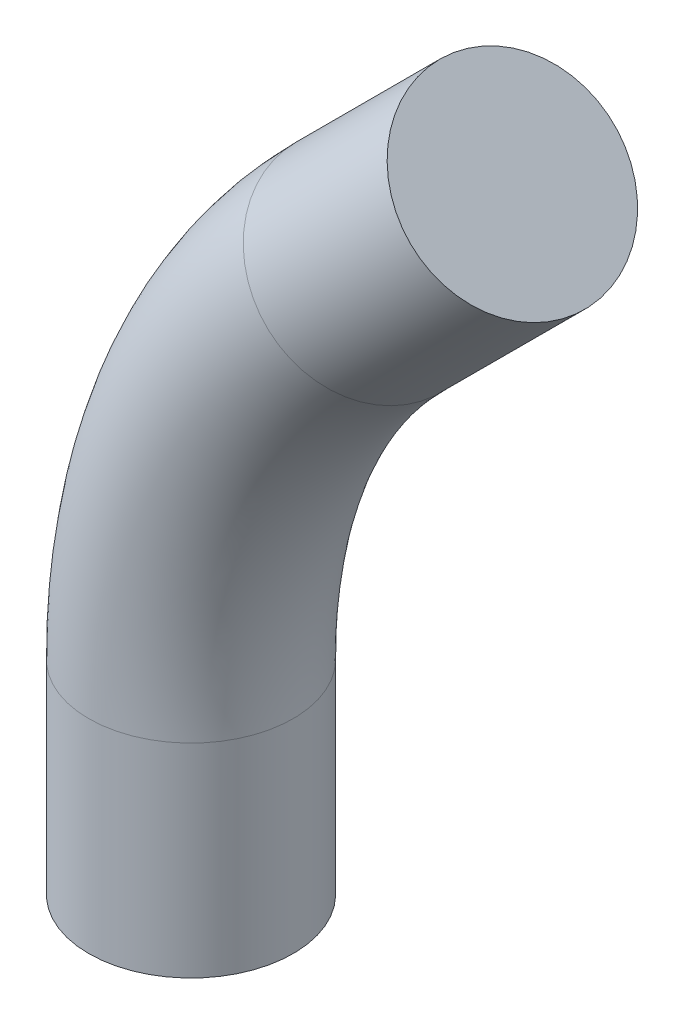
ISO-10303-21;
HEADER;
FILE_DESCRIPTION(('STEP AP214'),'2;1');
FILE_NAME('part.step','',(''),(''),'','','');
FILE_SCHEMA(('AUTOMOTIVE_DESIGN { 1 0 10303 214 1 1 1 1 }'));
ENDSEC;
DATA;
#1=APPLICATION_CONTEXT('core data for automotive mechanical design processes');
#2=APPLICATION_PROTOCOL_DEFINITION('international standard','automotive_design',2000,#1);
#3=PRODUCT_CONTEXT('',#1,'mechanical');
#4=PRODUCT('Part','Part','',(#3));
#5=PRODUCT_RELATED_PRODUCT_CATEGORY('part','',(#4));
#6=PRODUCT_DEFINITION_FORMATION('','',#4);
#7=PRODUCT_DEFINITION_CONTEXT('part definition',#1,'design');
#8=PRODUCT_DEFINITION('design','',#6,#7);
#9=PRODUCT_DEFINITION_SHAPE('','',#8);
#10=(LENGTH_UNIT() NAMED_UNIT(*) SI_UNIT(.MILLI.,.METRE.));
#11=(NAMED_UNIT(*) PLANE_ANGLE_UNIT() SI_UNIT($,.RADIAN.));
#12=(NAMED_UNIT(*) SI_UNIT($,.STERADIAN.) SOLID_ANGLE_UNIT());
#13=UNCERTAINTY_MEASURE_WITH_UNIT(LENGTH_MEASURE(1.E-05),#10,'distance_accuracy_value','');
#14=(GEOMETRIC_REPRESENTATION_CONTEXT(3) GLOBAL_UNCERTAINTY_ASSIGNED_CONTEXT((#13)) GLOBAL_UNIT_ASSIGNED_CONTEXT((#10,
#11,#12)) REPRESENTATION_CONTEXT('',''));
#15=CARTESIAN_POINT('',(0.,0.,0.));
#16=DIRECTION('',(0.,0.,1.));
#17=DIRECTION('',(1.,0.,0.));
#18=AXIS2_PLACEMENT_3D('',#15,#16,#17);
#19=CARTESIAN_POINT('',(0.,0.,0.));
#20=DIRECTION('',(0.,1.,0.));
#21=DIRECTION('',(0.,0.,1.));
#22=AXIS2_PLACEMENT_3D('',#19,#20,#21);
#23=PLANE('',#22);
#24=CARTESIAN_POINT('',(0.,0.,0.));
#25=DIRECTION('',(0.,1.,0.));
#26=DIRECTION('',(0.,0.,1.));
#27=AXIS2_PLACEMENT_3D('',#24,#25,#26);
#28=CIRCLE('',#27,6.75);
#29=CARTESIAN_POINT('',(0.,0.,6.75));
#30=VERTEX_POINT('',#29);
#31=EDGE_CURVE('E44',#30,#30,#28,.T.);
#32=ORIENTED_EDGE('',*,*,#31,.F.);
#33=EDGE_LOOP('',(#32));
#34=FACE_BOUND('',#33,.T.);
#35=ADVANCED_FACE('F32',(#34),#23,.F.);
#36=CARTESIAN_POINT('',(21.2132034355965,51.2132034355964,0.));
#37=DIRECTION('',(0.707106781186548,0.707106781186547,0.));
#38=DIRECTION('',(0.,0.,1.));
#39=AXIS2_PLACEMENT_3D('',#36,#37,#38);
#40=PLANE('',#39);
#41=CARTESIAN_POINT('',(21.2132034355965,51.2132034355964,0.));
#42=DIRECTION('',(0.707106781186548,0.707106781186547,0.));
#43=DIRECTION('',(0.,0.,1.));
#44=AXIS2_PLACEMENT_3D('',#41,#42,#43);
#45=CIRCLE('',#44,6.75);
#46=CARTESIAN_POINT('',(21.2132034355965,51.2132034355964,6.75));
#47=VERTEX_POINT('',#46);
#48=EDGE_CURVE('E11',#47,#47,#45,.T.);
#49=ORIENTED_EDGE('',*,*,#48,.T.);
#50=EDGE_LOOP('',(#49));
#51=FACE_BOUND('',#50,.T.);
#52=ADVANCED_FACE('F47',(#51),#40,.T.);
#53=CARTESIAN_POINT('',(0.,0.,0.));
#54=DIRECTION('',(0.,1.,0.));
#55=DIRECTION('',(0.,0.,1.));
#56=AXIS2_PLACEMENT_3D('',#53,#54,#55);
#57=CYLINDRICAL_SURFACE('',#56,6.75);
#58=CARTESIAN_POINT('',(0.,13.4314575050762,0.));
#59=DIRECTION('',(0.,1.,0.));
#60=DIRECTION('',(0.,0.,1.));
#61=AXIS2_PLACEMENT_3D('',#58,#59,#60);
#62=CIRCLE('',#61,6.75);
#63=CARTESIAN_POINT('',(-6.74999999999998,13.4314575050762,0.));
#64=VERTEX_POINT('',#63);
#65=EDGE_CURVE('E57',#64,#64,#62,.T.);
#66=ORIENTED_EDGE('',*,*,#65,.F.);
#67=EDGE_LOOP('',(#66));
#68=FACE_BOUND('',#67,.T.);
#69=ORIENTED_EDGE('',*,*,#31,.T.);
#70=EDGE_LOOP('',(#69));
#71=FACE_BOUND('',#70,.T.);
#72=ADVANCED_FACE('F62',(#68,#71),#57,.T.);
#73=CARTESIAN_POINT('',(40.,13.4314575050762,0.));
#74=DIRECTION('',(0.,0.,-1.));
#75=DIRECTION('',(-1.,0.,0.));
#76=AXIS2_PLACEMENT_3D('',#73,#74,#75);
#77=TOROIDAL_SURFACE('',#76,40.,6.75);
#78=CARTESIAN_POINT('',(11.7157287525381,41.7157287525381,0.));
#79=DIRECTION('',(0.707106781186548,0.707106781186547,0.));
#80=DIRECTION('',(0.,0.,1.));
#81=AXIS2_PLACEMENT_3D('',#78,#79,#80);
#82=CIRCLE('',#81,6.75);
#83=CARTESIAN_POINT('',(6.94275797952894,46.4886995255473,0.));
#84=VERTEX_POINT('',#83);
#85=EDGE_CURVE('E39',#84,#84,#82,.T.);
#86=CARTESIAN_POINT('',(40.,13.4314575050762,0.));
#87=DIRECTION('',(0.,0.,-1.));
#88=DIRECTION('',(-1.,0.,0.));
#89=AXIS2_PLACEMENT_3D('',#86,#87,#88);
#90=CIRCLE('',#89,46.75);
#91=EDGE_CURVE('',#64,#84,#90,.T.);
#92=ORIENTED_EDGE('',*,*,#65,.T.);
#93=ORIENTED_EDGE('',*,*,#85,.F.);
#94=ORIENTED_EDGE('',*,*,#91,.T.);
#95=ORIENTED_EDGE('',*,*,#91,.F.);
#96=EDGE_LOOP('',(#92,#94,#93,#95));
#97=FACE_BOUND('',#96,.T.);
#98=ADVANCED_FACE('F52',(#97),#77,.T.);
#99=CARTESIAN_POINT('',(11.7157287525381,41.7157287525381,0.));
#100=DIRECTION('',(0.707106781186548,0.707106781186547,0.));
#101=DIRECTION('',(-0.707106781186547,0.707106781186548,0.));
#102=AXIS2_PLACEMENT_3D('',#99,#100,#101);
#103=CYLINDRICAL_SURFACE('',#102,6.75);
#104=ORIENTED_EDGE('',*,*,#48,.F.);
#105=EDGE_LOOP('',(#104));
#106=FACE_BOUND('',#105,.T.);
#107=ORIENTED_EDGE('',*,*,#85,.T.);
#108=EDGE_LOOP('',(#107));
#109=FACE_BOUND('',#108,.T.);
#110=ADVANCED_FACE('F49',(#106,#109),#103,.T.);
#111=CLOSED_SHELL('',(#35,#52,#72,#98,#110));
#112=MANIFOLD_SOLID_BREP('B2',#111);
#113=ADVANCED_BREP_SHAPE_REPRESENTATION('',(#18,#112),#14);
#114=SHAPE_DEFINITION_REPRESENTATION(#9,#113);
ENDSEC;
END-ISO-10303-21;
